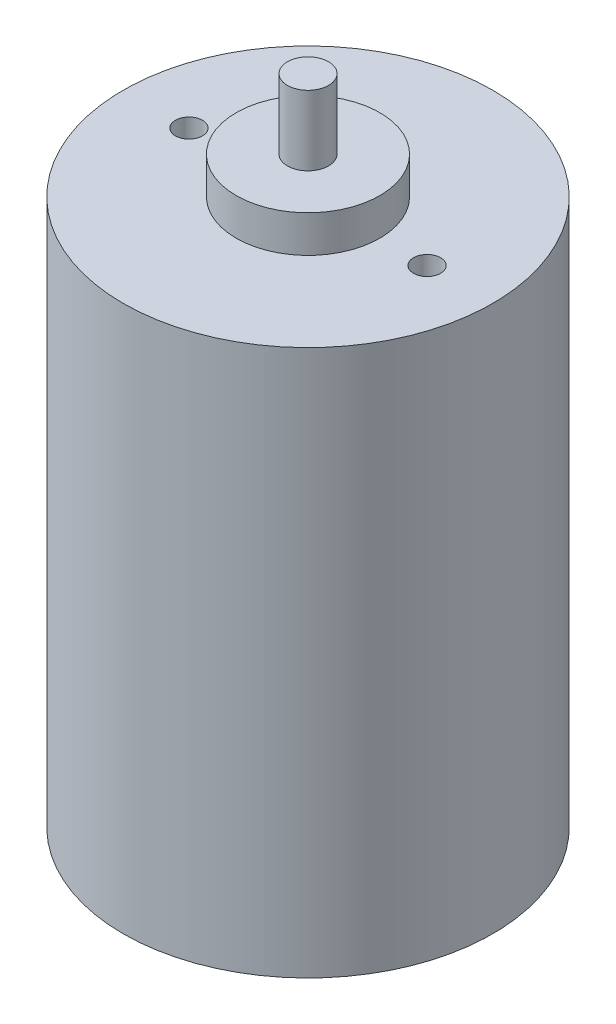
ISO-10303-21;
HEADER;
FILE_DESCRIPTION(('STEP AP214'),'2;1');
FILE_NAME('part.step','',(''),(''),'','','');
FILE_SCHEMA(('AUTOMOTIVE_DESIGN { 1 0 10303 214 1 1 1 1 }'));
ENDSEC;
DATA;
#1=APPLICATION_CONTEXT('core data for automotive mechanical design processes');
#2=APPLICATION_PROTOCOL_DEFINITION('international standard','automotive_design',2000,#1);
#3=PRODUCT_CONTEXT('',#1,'mechanical');
#4=PRODUCT('Part','Part','',(#3));
#5=PRODUCT_RELATED_PRODUCT_CATEGORY('part','',(#4));
#6=PRODUCT_DEFINITION_FORMATION('','',#4);
#7=PRODUCT_DEFINITION_CONTEXT('part definition',#1,'design');
#8=PRODUCT_DEFINITION('design','',#6,#7);
#9=PRODUCT_DEFINITION_SHAPE('','',#8);
#10=(LENGTH_UNIT() NAMED_UNIT(*) SI_UNIT(.MILLI.,.METRE.));
#11=(NAMED_UNIT(*) PLANE_ANGLE_UNIT() SI_UNIT($,.RADIAN.));
#12=(NAMED_UNIT(*) SI_UNIT($,.STERADIAN.) SOLID_ANGLE_UNIT());
#13=UNCERTAINTY_MEASURE_WITH_UNIT(LENGTH_MEASURE(1.E-05),#10,'distance_accuracy_value','');
#14=(GEOMETRIC_REPRESENTATION_CONTEXT(3) GLOBAL_UNCERTAINTY_ASSIGNED_CONTEXT((#13)) GLOBAL_UNIT_ASSIGNED_CONTEXT((#10,
#11,#12)) REPRESENTATION_CONTEXT('',''));
#15=CARTESIAN_POINT('',(0.,0.,0.));
#16=DIRECTION('',(0.,0.,1.));
#17=DIRECTION('',(1.,0.,0.));
#18=AXIS2_PLACEMENT_3D('',#15,#16,#17);
#19=CARTESIAN_POINT('',(0.,8.77549265306123,0.));
#20=DIRECTION('',(0.,1.,0.));
#21=DIRECTION('',(0.,0.,1.));
#22=AXIS2_PLACEMENT_3D('',#19,#20,#21);
#23=CYLINDRICAL_SURFACE('',#22,22.499955);
#24=CARTESIAN_POINT('',(0.,-66.499994,0.));
#25=DIRECTION('',(0.,1.,0.));
#26=DIRECTION('',(0.,0.,1.));
#27=AXIS2_PLACEMENT_3D('',#24,#25,#26);
#28=CIRCLE('',#27,22.499955);
#29=CARTESIAN_POINT('',(0.,-66.499994,22.499955));
#30=VERTEX_POINT('',#29);
#31=EDGE_CURVE('E71',#30,#30,#28,.T.);
#32=ORIENTED_EDGE('',*,*,#31,.T.);
#33=EDGE_LOOP('',(#32));
#34=FACE_BOUND('',#33,.T.);
#35=CARTESIAN_POINT('',(0.,0.,0.));
#36=DIRECTION('',(0.,1.,0.));
#37=DIRECTION('',(0.,0.,1.));
#38=AXIS2_PLACEMENT_3D('',#35,#36,#37);
#39=CIRCLE('',#38,22.499955);
#40=CARTESIAN_POINT('',(0.,0.,22.499955));
#41=VERTEX_POINT('',#40);
#42=EDGE_CURVE('E11',#41,#41,#39,.T.);
#43=ORIENTED_EDGE('',*,*,#42,.F.);
#44=EDGE_LOOP('',(#43));
#45=FACE_BOUND('',#44,.T.);
#46=ADVANCED_FACE('F37',(#34,#45),#23,.T.);
#47=CARTESIAN_POINT('',(0.,0.,0.));
#48=DIRECTION('',(0.,1.,0.));
#49=DIRECTION('',(0.,0.,1.));
#50=AXIS2_PLACEMENT_3D('',#47,#48,#49);
#51=PLANE('',#50);
#52=CARTESIAN_POINT('',(-14.499971,0.,0.));
#53=DIRECTION('',(0.,1.,0.));
#54=DIRECTION('',(0.,0.,1.));
#55=AXIS2_PLACEMENT_3D('',#52,#53,#54);
#56=CIRCLE('',#55,1.65);
#57=CARTESIAN_POINT('',(-14.499971,0.,1.65));
#58=VERTEX_POINT('',#57);
#59=EDGE_CURVE('E61',#58,#58,#56,.T.);
#60=ORIENTED_EDGE('',*,*,#59,.F.);
#61=EDGE_LOOP('',(#60));
#62=FACE_BOUND('',#61,.T.);
#63=CARTESIAN_POINT('',(14.499971,0.,0.));
#64=DIRECTION('',(0.,1.,0.));
#65=DIRECTION('',(0.,0.,1.));
#66=AXIS2_PLACEMENT_3D('',#63,#64,#65);
#67=CIRCLE('',#66,1.65);
#68=CARTESIAN_POINT('',(14.499971,0.,1.65));
#69=VERTEX_POINT('',#68);
#70=EDGE_CURVE('E60',#69,#69,#67,.T.);
#71=ORIENTED_EDGE('',*,*,#70,.F.);
#72=EDGE_LOOP('',(#71));
#73=FACE_BOUND('',#72,.T.);
#74=ORIENTED_EDGE('',*,*,#42,.T.);
#75=EDGE_LOOP('',(#74));
#76=FACE_BOUND('',#75,.T.);
#77=CARTESIAN_POINT('',(0.,0.,0.));
#78=DIRECTION('',(0.,1.,0.));
#79=DIRECTION('',(0.,0.,1.));
#80=AXIS2_PLACEMENT_3D('',#77,#78,#79);
#81=CIRCLE('',#80,8.75000028);
#82=CARTESIAN_POINT('',(0.,0.,8.75000028));
#83=VERTEX_POINT('',#82);
#84=EDGE_CURVE('E44',#83,#83,#81,.T.);
#85=ORIENTED_EDGE('',*,*,#84,.F.);
#86=EDGE_LOOP('',(#85));
#87=FACE_BOUND('',#86,.T.);
#88=ADVANCED_FACE('F87',(#62,#73,#76,#87),#51,.T.);
#89=CARTESIAN_POINT('',(0.,8.77549265306123,0.));
#90=DIRECTION('',(0.,1.,0.));
#91=DIRECTION('',(0.,0.,1.));
#92=AXIS2_PLACEMENT_3D('',#89,#90,#91);
#93=CYLINDRICAL_SURFACE('',#92,8.75000028);
#94=CARTESIAN_POINT('',(0.,4.499991,0.));
#95=DIRECTION('',(0.,1.,0.));
#96=DIRECTION('',(0.,0.,1.));
#97=AXIS2_PLACEMENT_3D('',#94,#95,#96);
#98=CIRCLE('',#97,8.75000028);
#99=CARTESIAN_POINT('',(0.,4.499991,8.75000028));
#100=VERTEX_POINT('',#99);
#101=EDGE_CURVE('E80',#100,#100,#98,.T.);
#102=ORIENTED_EDGE('',*,*,#101,.F.);
#103=EDGE_LOOP('',(#102));
#104=FACE_BOUND('',#103,.T.);
#105=ORIENTED_EDGE('',*,*,#84,.T.);
#106=EDGE_LOOP('',(#105));
#107=FACE_BOUND('',#106,.T.);
#108=ADVANCED_FACE('F85',(#104,#107),#93,.T.);
#109=CARTESIAN_POINT('',(0.,4.499991,0.));
#110=DIRECTION('',(0.,1.,0.));
#111=DIRECTION('',(0.,0.,1.));
#112=AXIS2_PLACEMENT_3D('',#109,#110,#111);
#113=PLANE('',#112);
#114=ORIENTED_EDGE('',*,*,#101,.T.);
#115=EDGE_LOOP('',(#114));
#116=FACE_BOUND('',#115,.T.);
#117=CARTESIAN_POINT('',(0.,4.499991,0.));
#118=DIRECTION('',(0.,1.,0.));
#119=DIRECTION('',(0.,0.,1.));
#120=AXIS2_PLACEMENT_3D('',#117,#118,#119);
#121=CIRCLE('',#120,2.499995);
#122=CARTESIAN_POINT('',(0.,4.499991,2.499995));
#123=VERTEX_POINT('',#122);
#124=EDGE_CURVE('E77',#123,#123,#121,.T.);
#125=ORIENTED_EDGE('',*,*,#124,.F.);
#126=EDGE_LOOP('',(#125));
#127=FACE_BOUND('',#126,.T.);
#128=ADVANCED_FACE('F94',(#116,#127),#113,.T.);
#129=CARTESIAN_POINT('',(0.,8.77549265306123,0.));
#130=DIRECTION('',(0.,1.,0.));
#131=DIRECTION('',(0.,0.,1.));
#132=AXIS2_PLACEMENT_3D('',#129,#130,#131);
#133=CYLINDRICAL_SURFACE('',#132,2.499995);
#134=CARTESIAN_POINT('',(0.,12.9999994,0.));
#135=DIRECTION('',(0.,1.,0.));
#136=DIRECTION('',(0.,0.,1.));
#137=AXIS2_PLACEMENT_3D('',#134,#135,#136);
#138=CIRCLE('',#137,2.499995);
#139=CARTESIAN_POINT('',(0.,12.9999994,2.499995));
#140=VERTEX_POINT('',#139);
#141=EDGE_CURVE('E74',#140,#140,#138,.T.);
#142=ORIENTED_EDGE('',*,*,#141,.F.);
#143=EDGE_LOOP('',(#142));
#144=FACE_BOUND('',#143,.T.);
#145=ORIENTED_EDGE('',*,*,#124,.T.);
#146=EDGE_LOOP('',(#145));
#147=FACE_BOUND('',#146,.T.);
#148=ADVANCED_FACE('F103',(#144,#147),#133,.T.);
#149=CARTESIAN_POINT('',(0.,12.9999994,0.));
#150=DIRECTION('',(0.,1.,0.));
#151=DIRECTION('',(0.,0.,1.));
#152=AXIS2_PLACEMENT_3D('',#149,#150,#151);
#153=PLANE('',#152);
#154=ORIENTED_EDGE('',*,*,#141,.T.);
#155=EDGE_LOOP('',(#154));
#156=FACE_BOUND('',#155,.T.);
#157=ADVANCED_FACE('F107',(#156),#153,.T.);
#158=CARTESIAN_POINT('',(0.,-66.499994,0.));
#159=DIRECTION('',(0.,1.,0.));
#160=DIRECTION('',(0.,0.,1.));
#161=AXIS2_PLACEMENT_3D('',#158,#159,#160);
#162=PLANE('',#161);
#163=ORIENTED_EDGE('',*,*,#31,.F.);
#164=EDGE_LOOP('',(#163));
#165=FACE_BOUND('',#164,.T.);
#166=ADVANCED_FACE('F111',(#165),#162,.F.);
#167=CARTESIAN_POINT('',(14.499971,-6.35,0.));
#168=DIRECTION('',(0.,1.,0.));
#169=DIRECTION('',(0.,0.,1.));
#170=AXIS2_PLACEMENT_3D('',#167,#168,#169);
#171=CONICAL_SURFACE('',#170,1.65,1.02974425867665);
#172=CARTESIAN_POINT('',(14.499971,-7.34142002139547,0.));
#173=VERTEX_POINT('',#172);
#174=VERTEX_LOOP('',#173);
#175=FACE_BOUND('',#174,.T.);
#176=CARTESIAN_POINT('',(14.499971,-6.35,0.));
#177=DIRECTION('',(0.,1.,0.));
#178=DIRECTION('',(0.,0.,1.));
#179=AXIS2_PLACEMENT_3D('',#176,#177,#178);
#180=CIRCLE('',#179,1.65);
#181=CARTESIAN_POINT('',(14.499971,-6.35,1.65));
#182=VERTEX_POINT('',#181);
#183=EDGE_CURVE('E64',#182,#182,#180,.T.);
#184=ORIENTED_EDGE('',*,*,#183,.T.);
#185=EDGE_LOOP('',(#184));
#186=FACE_BOUND('',#185,.T.);
#187=ADVANCED_FACE('F115',(#175,#186),#171,.F.);
#188=CARTESIAN_POINT('',(14.499971,0.,0.));
#189=DIRECTION('',(0.,1.,0.));
#190=DIRECTION('',(0.,0.,1.));
#191=AXIS2_PLACEMENT_3D('',#188,#189,#190);
#192=CYLINDRICAL_SURFACE('',#191,1.65);
#193=ORIENTED_EDGE('',*,*,#183,.F.);
#194=EDGE_LOOP('',(#193));
#195=FACE_BOUND('',#194,.T.);
#196=ORIENTED_EDGE('',*,*,#70,.T.);
#197=EDGE_LOOP('',(#196));
#198=FACE_BOUND('',#197,.T.);
#199=ADVANCED_FACE('F54',(#195,#198),#192,.F.);
#200=CARTESIAN_POINT('',(-14.499971,-6.35,0.));
#201=DIRECTION('',(0.,1.,0.));
#202=DIRECTION('',(0.,0.,1.));
#203=AXIS2_PLACEMENT_3D('',#200,#201,#202);
#204=CONICAL_SURFACE('',#203,1.65,1.02974425867665);
#205=CARTESIAN_POINT('',(-14.499971,-7.34142002139547,0.));
#206=VERTEX_POINT('',#205);
#207=VERTEX_LOOP('',#206);
#208=FACE_BOUND('',#207,.T.);
#209=CARTESIAN_POINT('',(-14.499971,-6.35,0.));
#210=DIRECTION('',(0.,1.,0.));
#211=DIRECTION('',(0.,0.,1.));
#212=AXIS2_PLACEMENT_3D('',#209,#210,#211);
#213=CIRCLE('',#212,1.65);
#214=CARTESIAN_POINT('',(-14.499971,-6.35,1.65));
#215=VERTEX_POINT('',#214);
#216=EDGE_CURVE('E58',#215,#215,#213,.T.);
#217=ORIENTED_EDGE('',*,*,#216,.T.);
#218=EDGE_LOOP('',(#217));
#219=FACE_BOUND('',#218,.T.);
#220=ADVANCED_FACE('F50',(#208,#219),#204,.F.);
#221=CARTESIAN_POINT('',(-14.499971,0.,0.));
#222=DIRECTION('',(0.,1.,0.));
#223=DIRECTION('',(0.,0.,1.));
#224=AXIS2_PLACEMENT_3D('',#221,#222,#223);
#225=CYLINDRICAL_SURFACE('',#224,1.65);
#226=ORIENTED_EDGE('',*,*,#216,.F.);
#227=EDGE_LOOP('',(#226));
#228=FACE_BOUND('',#227,.T.);
#229=ORIENTED_EDGE('',*,*,#59,.T.);
#230=EDGE_LOOP('',(#229));
#231=FACE_BOUND('',#230,.T.);
#232=ADVANCED_FACE('F53',(#228,#231),#225,.F.);
#233=CLOSED_SHELL('',(#46,#88,#108,#128,#148,#157,#166,#187,#199,#220,#232));
#234=MANIFOLD_SOLID_BREP('B2',#233);
#235=ADVANCED_BREP_SHAPE_REPRESENTATION('',(#18,#234),#14);
#236=SHAPE_DEFINITION_REPRESENTATION(#9,#235);
ENDSEC;
END-ISO-10303-21;
